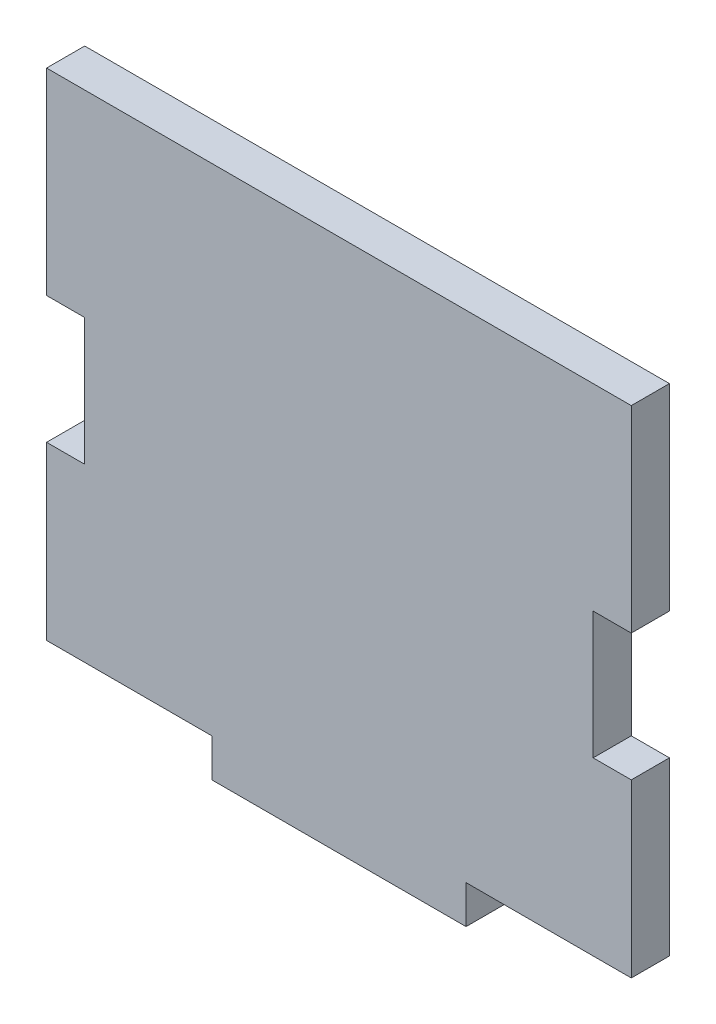
ISO-10303-21;
HEADER;
FILE_DESCRIPTION(('STEP AP214'),'2;1');
FILE_NAME('part.step','',(''),(''),'','','');
FILE_SCHEMA(('AUTOMOTIVE_DESIGN { 1 0 10303 214 1 1 1 1 }'));
ENDSEC;
DATA;
#1=APPLICATION_CONTEXT('core data for automotive mechanical design processes');
#2=APPLICATION_PROTOCOL_DEFINITION('international standard','automotive_design',2000,#1);
#3=PRODUCT_CONTEXT('',#1,'mechanical');
#4=PRODUCT('Part','Part','',(#3));
#5=PRODUCT_RELATED_PRODUCT_CATEGORY('part','',(#4));
#6=PRODUCT_DEFINITION_FORMATION('','',#4);
#7=PRODUCT_DEFINITION_CONTEXT('part definition',#1,'design');
#8=PRODUCT_DEFINITION('design','',#6,#7);
#9=PRODUCT_DEFINITION_SHAPE('','',#8);
#10=(LENGTH_UNIT() NAMED_UNIT(*) SI_UNIT(.MILLI.,.METRE.));
#11=(NAMED_UNIT(*) PLANE_ANGLE_UNIT() SI_UNIT($,.RADIAN.));
#12=(NAMED_UNIT(*) SI_UNIT($,.STERADIAN.) SOLID_ANGLE_UNIT());
#13=UNCERTAINTY_MEASURE_WITH_UNIT(LENGTH_MEASURE(1.E-05),#10,'distance_accuracy_value','');
#14=(GEOMETRIC_REPRESENTATION_CONTEXT(3) GLOBAL_UNCERTAINTY_ASSIGNED_CONTEXT((#13)) GLOBAL_UNIT_ASSIGNED_CONTEXT((#10,
#11,#12)) REPRESENTATION_CONTEXT('',''));
#15=CARTESIAN_POINT('',(0.,0.,0.));
#16=DIRECTION('',(0.,0.,1.));
#17=DIRECTION('',(1.,0.,0.));
#18=AXIS2_PLACEMENT_3D('',#15,#16,#17);
#19=CARTESIAN_POINT('',(-23.,21.,3.));
#20=DIRECTION('',(1.,0.,0.));
#21=DIRECTION('',(0.,0.,-1.));
#22=AXIS2_PLACEMENT_3D('',#19,#20,#21);
#23=PLANE('',#22);
#24=DIRECTION('',(0.,-1.,0.));
#25=VECTOR('',#24,1.);
#26=CARTESIAN_POINT('',(-23.,21.,0.));
#27=LINE('',#26,#25);
#28=CARTESIAN_POINT('',(-23.,21.,0.));
#29=VERTEX_POINT('',#28);
#30=CARTESIAN_POINT('',(-23.,5.49999999999998,0.));
#31=VERTEX_POINT('',#30);
#32=EDGE_CURVE('E262',#29,#31,#27,.T.);
#33=ORIENTED_EDGE('',*,*,#32,.T.);
#34=DIRECTION('',(0.,0.,-1.));
#35=VECTOR('',#34,1.);
#36=CARTESIAN_POINT('',(-23.,5.49999999999998,3.));
#37=LINE('',#36,#35);
#38=CARTESIAN_POINT('',(-23.,5.49999999999998,3.));
#39=VERTEX_POINT('',#38);
#40=EDGE_CURVE('E183',#39,#31,#37,.T.);
#41=ORIENTED_EDGE('',*,*,#40,.F.);
#42=DIRECTION('',(0.,-1.,0.));
#43=VECTOR('',#42,1.);
#44=CARTESIAN_POINT('',(-23.,21.,3.));
#45=LINE('',#44,#43);
#46=CARTESIAN_POINT('',(-23.,21.,3.));
#47=VERTEX_POINT('',#46);
#48=EDGE_CURVE('E248',#47,#39,#45,.T.);
#49=ORIENTED_EDGE('',*,*,#48,.F.);
#50=DIRECTION('',(0.,0.,-1.));
#51=VECTOR('',#50,1.);
#52=CARTESIAN_POINT('',(-23.,21.,3.));
#53=LINE('',#52,#51);
#54=EDGE_CURVE('E47',#47,#29,#53,.T.);
#55=ORIENTED_EDGE('',*,*,#54,.T.);
#56=EDGE_LOOP('',(#33,#41,#49,#55));
#57=FACE_BOUND('',#56,.T.);
#58=ADVANCED_FACE('F39',(#57),#23,.F.);
#59=CARTESIAN_POINT('',(23.,21.,3.));
#60=DIRECTION('',(-1.,0.,0.));
#61=DIRECTION('',(0.,0.,1.));
#62=AXIS2_PLACEMENT_3D('',#59,#60,#61);
#63=PLANE('',#62);
#64=DIRECTION('',(0.,1.,0.));
#65=VECTOR('',#64,1.);
#66=CARTESIAN_POINT('',(23.,21.,0.));
#67=LINE('',#66,#65);
#68=CARTESIAN_POINT('',(23.,-18.,0.));
#69=VERTEX_POINT('',#68);
#70=CARTESIAN_POINT('',(23.,-4.49999999999996,0.));
#71=VERTEX_POINT('',#70);
#72=EDGE_CURVE('E270',#69,#71,#67,.T.);
#73=ORIENTED_EDGE('',*,*,#72,.T.);
#74=DIRECTION('',(0.,0.,-1.));
#75=VECTOR('',#74,1.);
#76=CARTESIAN_POINT('',(23.,-4.49999999999996,3.));
#77=LINE('',#76,#75);
#78=CARTESIAN_POINT('',(23.,-4.49999999999996,3.));
#79=VERTEX_POINT('',#78);
#80=EDGE_CURVE('E205',#79,#71,#77,.T.);
#81=ORIENTED_EDGE('',*,*,#80,.F.);
#82=DIRECTION('',(0.,1.,0.));
#83=VECTOR('',#82,1.);
#84=CARTESIAN_POINT('',(23.,21.,3.));
#85=LINE('',#84,#83);
#86=CARTESIAN_POINT('',(23.,-18.,3.));
#87=VERTEX_POINT('',#86);
#88=EDGE_CURVE('E256',#87,#79,#85,.T.);
#89=ORIENTED_EDGE('',*,*,#88,.F.);
#90=DIRECTION('',(0.,0.,1.));
#91=VECTOR('',#90,1.);
#92=CARTESIAN_POINT('',(23.,-18.,0.));
#93=LINE('',#92,#91);
#94=EDGE_CURVE('E225',#69,#87,#93,.T.);
#95=ORIENTED_EDGE('',*,*,#94,.F.);
#96=EDGE_LOOP('',(#73,#81,#89,#95));
#97=FACE_BOUND('',#96,.T.);
#98=ADVANCED_FACE('F309',(#97),#63,.F.);
#99=CARTESIAN_POINT('',(-23.,-4.50000000000002,3.));
#100=VERTEX_POINT('',#99);
#101=CARTESIAN_POINT('',(-23.,-18.,3.));
#102=VERTEX_POINT('',#101);
#103=EDGE_CURVE('E252',#100,#102,#45,.T.);
#104=ORIENTED_EDGE('',*,*,#103,.F.);
#105=DIRECTION('',(0.,0.,-1.));
#106=VECTOR('',#105,1.);
#107=CARTESIAN_POINT('',(-23.,-4.50000000000002,3.));
#108=LINE('',#107,#106);
#109=CARTESIAN_POINT('',(-23.,-4.50000000000002,0.));
#110=VERTEX_POINT('',#109);
#111=EDGE_CURVE('E160',#100,#110,#108,.T.);
#112=ORIENTED_EDGE('',*,*,#111,.T.);
#113=CARTESIAN_POINT('',(-23.,-18.,0.));
#114=VERTEX_POINT('',#113);
#115=EDGE_CURVE('E244',#110,#114,#27,.T.);
#116=ORIENTED_EDGE('',*,*,#115,.T.);
#117=DIRECTION('',(0.,0.,1.));
#118=VECTOR('',#117,1.);
#119=CARTESIAN_POINT('',(-23.,-18.,0.));
#120=LINE('',#119,#118);
#121=EDGE_CURVE('E241',#114,#102,#120,.T.);
#122=ORIENTED_EDGE('',*,*,#121,.T.);
#123=EDGE_LOOP('',(#104,#112,#116,#122));
#124=FACE_BOUND('',#123,.T.);
#125=ADVANCED_FACE('F41',(#124),#23,.F.);
#126=CARTESIAN_POINT('',(-23.,-21.,3.));
#127=DIRECTION('',(0.,1.,0.));
#128=DIRECTION('',(0.,0.,1.));
#129=AXIS2_PLACEMENT_3D('',#126,#127,#128);
#130=PLANE('',#129);
#131=DIRECTION('',(1.,0.,0.));
#132=VECTOR('',#131,1.);
#133=CARTESIAN_POINT('',(-23.,-21.,0.));
#134=LINE('',#133,#132);
#135=CARTESIAN_POINT('',(-10.,-21.,0.));
#136=VERTEX_POINT('',#135);
#137=CARTESIAN_POINT('',(10.,-21.,0.));
#138=VERTEX_POINT('',#137);
#139=EDGE_CURVE('E266',#136,#138,#134,.T.);
#140=ORIENTED_EDGE('',*,*,#139,.T.);
#141=DIRECTION('',(0.,0.,1.));
#142=VECTOR('',#141,1.);
#143=CARTESIAN_POINT('',(10.,-21.,0.));
#144=LINE('',#143,#142);
#145=CARTESIAN_POINT('',(10.,-21.,3.));
#146=VERTEX_POINT('',#145);
#147=EDGE_CURVE('E218',#138,#146,#144,.T.);
#148=ORIENTED_EDGE('',*,*,#147,.T.);
#149=DIRECTION('',(1.,0.,0.));
#150=VECTOR('',#149,1.);
#151=CARTESIAN_POINT('',(-23.,-21.,3.));
#152=LINE('',#151,#150);
#153=CARTESIAN_POINT('',(-10.,-21.,3.));
#154=VERTEX_POINT('',#153);
#155=EDGE_CURVE('E251',#154,#146,#152,.T.);
#156=ORIENTED_EDGE('',*,*,#155,.F.);
#157=DIRECTION('',(0.,0.,1.));
#158=VECTOR('',#157,1.);
#159=CARTESIAN_POINT('',(-10.,-21.,0.));
#160=LINE('',#159,#158);
#161=EDGE_CURVE('E236',#136,#154,#160,.T.);
#162=ORIENTED_EDGE('',*,*,#161,.F.);
#163=EDGE_LOOP('',(#140,#148,#156,#162));
#164=FACE_BOUND('',#163,.T.);
#165=ADVANCED_FACE('F321',(#164),#130,.F.);
#166=CARTESIAN_POINT('',(23.,5.50000000000003,3.));
#167=VERTEX_POINT('',#166);
#168=CARTESIAN_POINT('',(23.,21.,3.));
#169=VERTEX_POINT('',#168);
#170=EDGE_CURVE('E255',#167,#169,#85,.T.);
#171=ORIENTED_EDGE('',*,*,#170,.F.);
#172=DIRECTION('',(0.,0.,-1.));
#173=VECTOR('',#172,1.);
#174=CARTESIAN_POINT('',(23.,5.50000000000003,3.));
#175=LINE('',#174,#173);
#176=CARTESIAN_POINT('',(23.,5.50000000000003,0.));
#177=VERTEX_POINT('',#176);
#178=EDGE_CURVE('E207',#167,#177,#175,.T.);
#179=ORIENTED_EDGE('',*,*,#178,.T.);
#180=CARTESIAN_POINT('',(23.,21.,0.));
#181=VERTEX_POINT('',#180);
#182=EDGE_CURVE('E269',#177,#181,#67,.T.);
#183=ORIENTED_EDGE('',*,*,#182,.T.);
#184=DIRECTION('',(0.,0.,-1.));
#185=VECTOR('',#184,1.);
#186=CARTESIAN_POINT('',(23.,21.,3.));
#187=LINE('',#186,#185);
#188=EDGE_CURVE('E11',#169,#181,#187,.T.);
#189=ORIENTED_EDGE('',*,*,#188,.F.);
#190=EDGE_LOOP('',(#171,#179,#183,#189));
#191=FACE_BOUND('',#190,.T.);
#192=ADVANCED_FACE('F295',(#191),#63,.F.);
#193=CARTESIAN_POINT('',(-23.,21.,3.));
#194=DIRECTION('',(0.,-1.,0.));
#195=DIRECTION('',(0.,0.,-1.));
#196=AXIS2_PLACEMENT_3D('',#193,#194,#195);
#197=PLANE('',#196);
#198=DIRECTION('',(-1.,0.,0.));
#199=VECTOR('',#198,1.);
#200=CARTESIAN_POINT('',(-23.,21.,0.));
#201=LINE('',#200,#199);
#202=EDGE_CURVE('E273',#181,#29,#201,.T.);
#203=ORIENTED_EDGE('',*,*,#202,.T.);
#204=ORIENTED_EDGE('',*,*,#54,.F.);
#205=DIRECTION('',(-1.,0.,0.));
#206=VECTOR('',#205,1.);
#207=CARTESIAN_POINT('',(-23.,21.,3.));
#208=LINE('',#207,#206);
#209=EDGE_CURVE('E259',#169,#47,#208,.T.);
#210=ORIENTED_EDGE('',*,*,#209,.F.);
#211=ORIENTED_EDGE('',*,*,#188,.T.);
#212=EDGE_LOOP('',(#203,#204,#210,#211));
#213=FACE_BOUND('',#212,.T.);
#214=ADVANCED_FACE('F293',(#213),#197,.F.);
#215=CARTESIAN_POINT('',(0.,0.,3.));
#216=DIRECTION('',(0.,0.,1.));
#217=DIRECTION('',(1.,0.,0.));
#218=AXIS2_PLACEMENT_3D('',#215,#216,#217);
#219=PLANE('',#218);
#220=DIRECTION('',(1.,0.,0.));
#221=VECTOR('',#220,1.);
#222=CARTESIAN_POINT('',(-20.0000000000001,5.49999999999998,3.));
#223=LINE('',#222,#221);
#224=CARTESIAN_POINT('',(-20.0000000000001,5.49999999999998,3.));
#225=VERTEX_POINT('',#224);
#226=EDGE_CURVE('E161',#39,#225,#223,.T.);
#227=ORIENTED_EDGE('',*,*,#226,.T.);
#228=DIRECTION('',(0.,-1.,0.));
#229=VECTOR('',#228,1.);
#230=CARTESIAN_POINT('',(-20.0000000000001,5.49999999999998,3.));
#231=LINE('',#230,#229);
#232=CARTESIAN_POINT('',(-20.0000000000001,-4.50000000000002,3.));
#233=VERTEX_POINT('',#232);
#234=EDGE_CURVE('E156',#225,#233,#231,.T.);
#235=ORIENTED_EDGE('',*,*,#234,.T.);
#236=DIRECTION('',(-1.,0.,0.));
#237=VECTOR('',#236,1.);
#238=CARTESIAN_POINT('',(-20.0000000000001,-4.50000000000002,3.));
#239=LINE('',#238,#237);
#240=EDGE_CURVE('E164',#233,#100,#239,.T.);
#241=ORIENTED_EDGE('',*,*,#240,.T.);
#242=ORIENTED_EDGE('',*,*,#103,.T.);
#243=DIRECTION('',(-1.,0.,0.));
#244=VECTOR('',#243,1.);
#245=CARTESIAN_POINT('',(-23.,-18.,3.));
#246=LINE('',#245,#244);
#247=CARTESIAN_POINT('',(-9.99999999999999,-18.,3.));
#248=VERTEX_POINT('',#247);
#249=EDGE_CURVE('E233',#248,#102,#246,.T.);
#250=ORIENTED_EDGE('',*,*,#249,.F.);
#251=DIRECTION('',(0.,1.,0.));
#252=VECTOR('',#251,1.);
#253=CARTESIAN_POINT('',(-9.99999999999999,-18.,3.));
#254=LINE('',#253,#252);
#255=EDGE_CURVE('E224',#154,#248,#254,.T.);
#256=ORIENTED_EDGE('',*,*,#255,.F.);
#257=ORIENTED_EDGE('',*,*,#155,.T.);
#258=DIRECTION('',(0.,-1.,0.));
#259=VECTOR('',#258,1.);
#260=CARTESIAN_POINT('',(10.,-18.,3.));
#261=LINE('',#260,#259);
#262=CARTESIAN_POINT('',(10.,-18.,3.));
#263=VERTEX_POINT('',#262);
#264=EDGE_CURVE('E204',#263,#146,#261,.T.);
#265=ORIENTED_EDGE('',*,*,#264,.F.);
#266=DIRECTION('',(-1.,0.,0.));
#267=VECTOR('',#266,1.);
#268=CARTESIAN_POINT('',(10.,-18.,3.));
#269=LINE('',#268,#267);
#270=EDGE_CURVE('E215',#87,#263,#269,.T.);
#271=ORIENTED_EDGE('',*,*,#270,.F.);
#272=ORIENTED_EDGE('',*,*,#88,.T.);
#273=DIRECTION('',(-1.,0.,0.));
#274=VECTOR('',#273,1.);
#275=CARTESIAN_POINT('',(20.,-4.49999999999996,3.));
#276=LINE('',#275,#274);
#277=CARTESIAN_POINT('',(20.,-4.49999999999996,3.));
#278=VERTEX_POINT('',#277);
#279=EDGE_CURVE('E193',#79,#278,#276,.T.);
#280=ORIENTED_EDGE('',*,*,#279,.T.);
#281=DIRECTION('',(0.,1.,0.));
#282=VECTOR('',#281,1.);
#283=CARTESIAN_POINT('',(20.,5.50000000000003,3.));
#284=LINE('',#283,#282);
#285=CARTESIAN_POINT('',(20.,5.50000000000003,3.));
#286=VERTEX_POINT('',#285);
#287=EDGE_CURVE('E186',#278,#286,#284,.T.);
#288=ORIENTED_EDGE('',*,*,#287,.T.);
#289=DIRECTION('',(1.,0.,0.));
#290=VECTOR('',#289,1.);
#291=CARTESIAN_POINT('',(20.,5.50000000000003,3.));
#292=LINE('',#291,#290);
#293=EDGE_CURVE('E189',#286,#167,#292,.T.);
#294=ORIENTED_EDGE('',*,*,#293,.T.);
#295=ORIENTED_EDGE('',*,*,#170,.T.);
#296=ORIENTED_EDGE('',*,*,#209,.T.);
#297=ORIENTED_EDGE('',*,*,#48,.T.);
#298=EDGE_LOOP('',(#227,#235,#241,#242,#250,#256,#257,#265,#271,#272,#280,#288,#294,#295,#296,#297));
#299=FACE_BOUND('',#298,.T.);
#300=ADVANCED_FACE('F170',(#299),#219,.T.);
#301=CARTESIAN_POINT('',(0.,0.,0.));
#302=DIRECTION('',(0.,0.,1.));
#303=DIRECTION('',(1.,0.,0.));
#304=AXIS2_PLACEMENT_3D('',#301,#302,#303);
#305=PLANE('',#304);
#306=DIRECTION('',(0.,-1.,0.));
#307=VECTOR('',#306,1.);
#308=CARTESIAN_POINT('',(-20.0000000000001,5.49999999999998,0.));
#309=LINE('',#308,#307);
#310=CARTESIAN_POINT('',(-20.0000000000001,5.49999999999998,0.));
#311=VERTEX_POINT('',#310);
#312=CARTESIAN_POINT('',(-20.0000000000001,-4.50000000000002,0.));
#313=VERTEX_POINT('',#312);
#314=EDGE_CURVE('E54',#311,#313,#309,.T.);
#315=ORIENTED_EDGE('',*,*,#314,.F.);
#316=DIRECTION('',(1.,0.,0.));
#317=VECTOR('',#316,1.);
#318=CARTESIAN_POINT('',(-20.0000000000001,5.49999999999998,0.));
#319=LINE('',#318,#317);
#320=EDGE_CURVE('E172',#31,#311,#319,.T.);
#321=ORIENTED_EDGE('',*,*,#320,.F.);
#322=ORIENTED_EDGE('',*,*,#32,.F.);
#323=ORIENTED_EDGE('',*,*,#202,.F.);
#324=ORIENTED_EDGE('',*,*,#182,.F.);
#325=DIRECTION('',(1.,0.,0.));
#326=VECTOR('',#325,1.);
#327=CARTESIAN_POINT('',(20.,5.50000000000003,0.));
#328=LINE('',#327,#326);
#329=CARTESIAN_POINT('',(20.,5.50000000000003,0.));
#330=VERTEX_POINT('',#329);
#331=EDGE_CURVE('E198',#330,#177,#328,.T.);
#332=ORIENTED_EDGE('',*,*,#331,.F.);
#333=DIRECTION('',(0.,1.,0.));
#334=VECTOR('',#333,1.);
#335=CARTESIAN_POINT('',(20.,5.50000000000003,0.));
#336=LINE('',#335,#334);
#337=CARTESIAN_POINT('',(20.,-4.49999999999996,0.));
#338=VERTEX_POINT('',#337);
#339=EDGE_CURVE('E62',#338,#330,#336,.T.);
#340=ORIENTED_EDGE('',*,*,#339,.F.);
#341=DIRECTION('',(-1.,0.,0.));
#342=VECTOR('',#341,1.);
#343=CARTESIAN_POINT('',(20.,-4.49999999999996,0.));
#344=LINE('',#343,#342);
#345=EDGE_CURVE('E190',#71,#338,#344,.T.);
#346=ORIENTED_EDGE('',*,*,#345,.F.);
#347=ORIENTED_EDGE('',*,*,#72,.F.);
#348=DIRECTION('',(-1.,0.,0.));
#349=VECTOR('',#348,1.);
#350=CARTESIAN_POINT('',(10.,-18.,0.));
#351=LINE('',#350,#349);
#352=CARTESIAN_POINT('',(10.,-18.,0.));
#353=VERTEX_POINT('',#352);
#354=EDGE_CURVE('E214',#69,#353,#351,.T.);
#355=ORIENTED_EDGE('',*,*,#354,.T.);
#356=DIRECTION('',(0.,-1.,0.));
#357=VECTOR('',#356,1.);
#358=CARTESIAN_POINT('',(10.,-18.,0.));
#359=LINE('',#358,#357);
#360=EDGE_CURVE('E211',#353,#138,#359,.T.);
#361=ORIENTED_EDGE('',*,*,#360,.T.);
#362=ORIENTED_EDGE('',*,*,#139,.F.);
#363=DIRECTION('',(0.,1.,0.));
#364=VECTOR('',#363,1.);
#365=CARTESIAN_POINT('',(-9.99999999999999,-18.,0.));
#366=LINE('',#365,#364);
#367=CARTESIAN_POINT('',(-9.99999999999999,-18.,0.));
#368=VERTEX_POINT('',#367);
#369=EDGE_CURVE('E229',#136,#368,#366,.T.);
#370=ORIENTED_EDGE('',*,*,#369,.T.);
#371=DIRECTION('',(-1.,0.,0.));
#372=VECTOR('',#371,1.);
#373=CARTESIAN_POINT('',(-23.,-18.,0.));
#374=LINE('',#373,#372);
#375=EDGE_CURVE('E232',#368,#114,#374,.T.);
#376=ORIENTED_EDGE('',*,*,#375,.T.);
#377=ORIENTED_EDGE('',*,*,#115,.F.);
#378=DIRECTION('',(-1.,0.,0.));
#379=VECTOR('',#378,1.);
#380=CARTESIAN_POINT('',(-20.0000000000001,-4.50000000000002,0.));
#381=LINE('',#380,#379);
#382=EDGE_CURVE('E175',#313,#110,#381,.T.);
#383=ORIENTED_EDGE('',*,*,#382,.F.);
#384=EDGE_LOOP('',(#315,#321,#322,#323,#324,#332,#340,#346,#347,#355,#361,#362,#370,#376,#377,#383));
#385=FACE_BOUND('',#384,.T.);
#386=ADVANCED_FACE('F287',(#385),#305,.F.);
#387=CARTESIAN_POINT('',(-23.,-18.,0.));
#388=DIRECTION('',(0.,1.,0.));
#389=DIRECTION('',(-1.,0.,0.));
#390=AXIS2_PLACEMENT_3D('',#387,#388,#389);
#391=PLANE('',#390);
#392=ORIENTED_EDGE('',*,*,#249,.T.);
#393=ORIENTED_EDGE('',*,*,#121,.F.);
#394=ORIENTED_EDGE('',*,*,#375,.F.);
#395=DIRECTION('',(0.,0.,1.));
#396=VECTOR('',#395,1.);
#397=CARTESIAN_POINT('',(-9.99999999999999,-18.,0.));
#398=LINE('',#397,#396);
#399=EDGE_CURVE('E245',#368,#248,#398,.T.);
#400=ORIENTED_EDGE('',*,*,#399,.T.);
#401=EDGE_LOOP('',(#392,#393,#394,#400));
#402=FACE_BOUND('',#401,.T.);
#403=ADVANCED_FACE('F331',(#402),#391,.F.);
#404=CARTESIAN_POINT('',(-9.99999999999999,-18.,0.));
#405=DIRECTION('',(1.,0.,0.));
#406=DIRECTION('',(0.,1.,0.));
#407=AXIS2_PLACEMENT_3D('',#404,#405,#406);
#408=PLANE('',#407);
#409=ORIENTED_EDGE('',*,*,#255,.T.);
#410=ORIENTED_EDGE('',*,*,#399,.F.);
#411=ORIENTED_EDGE('',*,*,#369,.F.);
#412=ORIENTED_EDGE('',*,*,#161,.T.);
#413=EDGE_LOOP('',(#409,#410,#411,#412));
#414=FACE_BOUND('',#413,.T.);
#415=ADVANCED_FACE('F327',(#414),#408,.F.);
#416=CARTESIAN_POINT('',(10.,-18.,0.));
#417=DIRECTION('',(-1.,0.,0.));
#418=DIRECTION('',(0.,-1.,0.));
#419=AXIS2_PLACEMENT_3D('',#416,#417,#418);
#420=PLANE('',#419);
#421=ORIENTED_EDGE('',*,*,#264,.T.);
#422=ORIENTED_EDGE('',*,*,#147,.F.);
#423=ORIENTED_EDGE('',*,*,#360,.F.);
#424=DIRECTION('',(0.,0.,1.));
#425=VECTOR('',#424,1.);
#426=CARTESIAN_POINT('',(10.,-18.,0.));
#427=LINE('',#426,#425);
#428=EDGE_CURVE('E222',#353,#263,#427,.T.);
#429=ORIENTED_EDGE('',*,*,#428,.T.);
#430=EDGE_LOOP('',(#421,#422,#423,#429));
#431=FACE_BOUND('',#430,.T.);
#432=ADVANCED_FACE('F318',(#431),#420,.F.);
#433=CARTESIAN_POINT('',(10.,-18.,0.));
#434=DIRECTION('',(0.,1.,0.));
#435=DIRECTION('',(0.,0.,1.));
#436=AXIS2_PLACEMENT_3D('',#433,#434,#435);
#437=PLANE('',#436);
#438=ORIENTED_EDGE('',*,*,#270,.T.);
#439=ORIENTED_EDGE('',*,*,#428,.F.);
#440=ORIENTED_EDGE('',*,*,#354,.F.);
#441=ORIENTED_EDGE('',*,*,#94,.T.);
#442=EDGE_LOOP('',(#438,#439,#440,#441));
#443=FACE_BOUND('',#442,.T.);
#444=ADVANCED_FACE('F315',(#443),#437,.F.);
#445=CARTESIAN_POINT('',(20.,5.50000000000003,3.));
#446=DIRECTION('',(-1.,0.,0.));
#447=DIRECTION('',(0.,0.,1.));
#448=AXIS2_PLACEMENT_3D('',#445,#446,#447);
#449=PLANE('',#448);
#450=ORIENTED_EDGE('',*,*,#339,.T.);
#451=DIRECTION('',(0.,0.,-1.));
#452=VECTOR('',#451,1.);
#453=CARTESIAN_POINT('',(20.,5.50000000000003,3.));
#454=LINE('',#453,#452);
#455=EDGE_CURVE('E196',#286,#330,#454,.T.);
#456=ORIENTED_EDGE('',*,*,#455,.F.);
#457=ORIENTED_EDGE('',*,*,#287,.F.);
#458=DIRECTION('',(0.,0.,-1.));
#459=VECTOR('',#458,1.);
#460=CARTESIAN_POINT('',(20.,-4.49999999999996,3.));
#461=LINE('',#460,#459);
#462=EDGE_CURVE('E202',#278,#338,#461,.T.);
#463=ORIENTED_EDGE('',*,*,#462,.T.);
#464=EDGE_LOOP('',(#450,#456,#457,#463));
#465=FACE_BOUND('',#464,.T.);
#466=ADVANCED_FACE('F302',(#465),#449,.F.);
#467=CARTESIAN_POINT('',(20.,-4.49999999999996,3.));
#468=DIRECTION('',(0.,-1.,0.));
#469=DIRECTION('',(0.,0.,-1.));
#470=AXIS2_PLACEMENT_3D('',#467,#468,#469);
#471=PLANE('',#470);
#472=ORIENTED_EDGE('',*,*,#345,.T.);
#473=ORIENTED_EDGE('',*,*,#462,.F.);
#474=ORIENTED_EDGE('',*,*,#279,.F.);
#475=ORIENTED_EDGE('',*,*,#80,.T.);
#476=EDGE_LOOP('',(#472,#473,#474,#475));
#477=FACE_BOUND('',#476,.T.);
#478=ADVANCED_FACE('F307',(#477),#471,.F.);
#479=CARTESIAN_POINT('',(20.,5.50000000000003,3.));
#480=DIRECTION('',(0.,1.,0.));
#481=DIRECTION('',(0.,0.,1.));
#482=AXIS2_PLACEMENT_3D('',#479,#480,#481);
#483=PLANE('',#482);
#484=ORIENTED_EDGE('',*,*,#331,.T.);
#485=ORIENTED_EDGE('',*,*,#178,.F.);
#486=ORIENTED_EDGE('',*,*,#293,.F.);
#487=ORIENTED_EDGE('',*,*,#455,.T.);
#488=EDGE_LOOP('',(#484,#485,#486,#487));
#489=FACE_BOUND('',#488,.T.);
#490=ADVANCED_FACE('F299',(#489),#483,.F.);
#491=CARTESIAN_POINT('',(-20.0000000000001,5.49999999999998,3.));
#492=DIRECTION('',(1.,0.,0.));
#493=DIRECTION('',(0.,0.,-1.));
#494=AXIS2_PLACEMENT_3D('',#491,#492,#493);
#495=PLANE('',#494);
#496=ORIENTED_EDGE('',*,*,#314,.T.);
#497=DIRECTION('',(0.,0.,-1.));
#498=VECTOR('',#497,1.);
#499=CARTESIAN_POINT('',(-20.0000000000001,-4.50000000000002,3.));
#500=LINE('',#499,#498);
#501=EDGE_CURVE('E152',#233,#313,#500,.T.);
#502=ORIENTED_EDGE('',*,*,#501,.F.);
#503=ORIENTED_EDGE('',*,*,#234,.F.);
#504=DIRECTION('',(0.,0.,-1.));
#505=VECTOR('',#504,1.);
#506=CARTESIAN_POINT('',(-20.0000000000001,5.49999999999998,3.));
#507=LINE('',#506,#505);
#508=EDGE_CURVE('E181',#225,#311,#507,.T.);
#509=ORIENTED_EDGE('',*,*,#508,.T.);
#510=EDGE_LOOP('',(#496,#502,#503,#509));
#511=FACE_BOUND('',#510,.T.);
#512=ADVANCED_FACE('F154',(#511),#495,.F.);
#513=CARTESIAN_POINT('',(-20.0000000000001,5.49999999999998,3.));
#514=DIRECTION('',(0.,1.,0.));
#515=DIRECTION('',(0.,0.,1.));
#516=AXIS2_PLACEMENT_3D('',#513,#514,#515);
#517=PLANE('',#516);
#518=ORIENTED_EDGE('',*,*,#320,.T.);
#519=ORIENTED_EDGE('',*,*,#508,.F.);
#520=ORIENTED_EDGE('',*,*,#226,.F.);
#521=ORIENTED_EDGE('',*,*,#40,.T.);
#522=EDGE_LOOP('',(#518,#519,#520,#521));
#523=FACE_BOUND('',#522,.T.);
#524=ADVANCED_FACE('F290',(#523),#517,.F.);
#525=CARTESIAN_POINT('',(-20.0000000000001,-4.50000000000002,3.));
#526=DIRECTION('',(0.,-1.,0.));
#527=DIRECTION('',(0.,0.,-1.));
#528=AXIS2_PLACEMENT_3D('',#525,#526,#527);
#529=PLANE('',#528);
#530=ORIENTED_EDGE('',*,*,#382,.T.);
#531=ORIENTED_EDGE('',*,*,#111,.F.);
#532=ORIENTED_EDGE('',*,*,#240,.F.);
#533=ORIENTED_EDGE('',*,*,#501,.T.);
#534=EDGE_LOOP('',(#530,#531,#532,#533));
#535=FACE_BOUND('',#534,.T.);
#536=ADVANCED_FACE('F165',(#535),#529,.F.);
#537=CLOSED_SHELL('',(#58,#98,#125,#165,#192,#214,#300,#386,#403,#415,#432,#444,#466,#478,#490,
#512,#524,#536));
#538=MANIFOLD_SOLID_BREP('B2',#537);
#539=ADVANCED_BREP_SHAPE_REPRESENTATION('',(#18,#538),#14);
#540=SHAPE_DEFINITION_REPRESENTATION(#9,#539);
ENDSEC;
END-ISO-10303-21;
